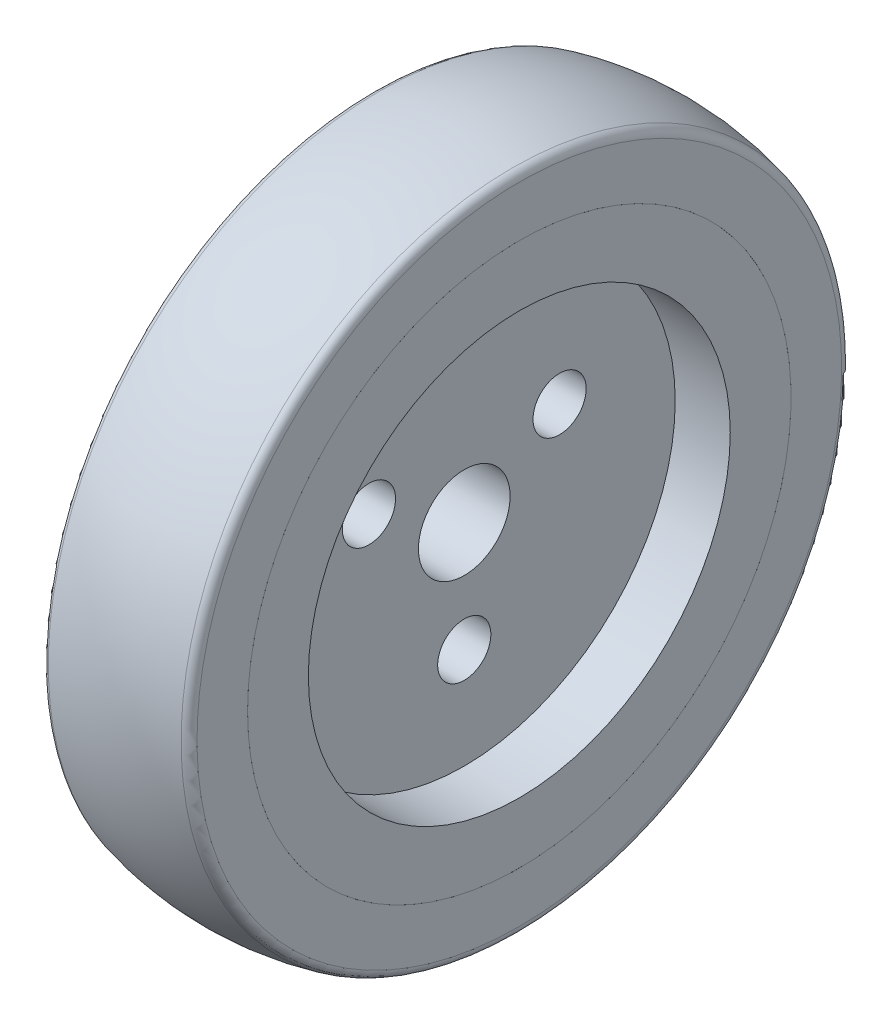
ISO-10303-21;
HEADER;
FILE_DESCRIPTION(('STEP AP214'),'2;1');
FILE_NAME('part.step','',(''),(''),'','','');
FILE_SCHEMA(('AUTOMOTIVE_DESIGN { 1 0 10303 214 1 1 1 1 }'));
ENDSEC;
DATA;
#1=APPLICATION_CONTEXT('core data for automotive mechanical design processes');
#2=APPLICATION_PROTOCOL_DEFINITION('international standard','automotive_design',2000,#1);
#3=PRODUCT_CONTEXT('',#1,'mechanical');
#4=PRODUCT('Part','Part','',(#3));
#5=PRODUCT_RELATED_PRODUCT_CATEGORY('part','',(#4));
#6=PRODUCT_DEFINITION_FORMATION('','',#4);
#7=PRODUCT_DEFINITION_CONTEXT('part definition',#1,'design');
#8=PRODUCT_DEFINITION('design','',#6,#7);
#9=PRODUCT_DEFINITION_SHAPE('','',#8);
#10=(LENGTH_UNIT() NAMED_UNIT(*) SI_UNIT(.MILLI.,.METRE.));
#11=(NAMED_UNIT(*) PLANE_ANGLE_UNIT() SI_UNIT($,.RADIAN.));
#12=(NAMED_UNIT(*) SI_UNIT($,.STERADIAN.) SOLID_ANGLE_UNIT());
#13=UNCERTAINTY_MEASURE_WITH_UNIT(LENGTH_MEASURE(1.E-05),#10,'distance_accuracy_value','');
#14=(GEOMETRIC_REPRESENTATION_CONTEXT(3) GLOBAL_UNCERTAINTY_ASSIGNED_CONTEXT((#13)) GLOBAL_UNIT_ASSIGNED_CONTEXT((#10,
#11,#12)) REPRESENTATION_CONTEXT('',''));
#15=CARTESIAN_POINT('',(0.,0.,0.));
#16=DIRECTION('',(0.,0.,1.));
#17=DIRECTION('',(1.,0.,0.));
#18=AXIS2_PLACEMENT_3D('',#15,#16,#17);
#19=CARTESIAN_POINT('',(4.,17.956832294801,0.));
#20=DIRECTION('',(-1.,0.,0.));
#21=DIRECTION('',(0.,-1.,0.));
#22=AXIS2_PLACEMENT_3D('',#19,#20,#21);
#23=PLANE('',#22);
#24=CARTESIAN_POINT('',(4.,0.,0.));
#25=DIRECTION('',(-1.,0.,0.));
#26=DIRECTION('',(0.,-1.,0.));
#27=AXIS2_PLACEMENT_3D('',#24,#25,#26);
#28=CIRCLE('',#27,17.5712472794703);
#29=CARTESIAN_POINT('',(4.,-17.5712472794703,0.));
#30=VERTEX_POINT('',#29);
#31=EDGE_CURVE('E11',#30,#30,#28,.F.);
#32=ORIENTED_EDGE('',*,*,#31,.T.);
#33=EDGE_LOOP('',(#32));
#34=FACE_BOUND('',#33,.T.);
#35=CARTESIAN_POINT('',(4.00000000000001,0.,0.));
#36=DIRECTION('',(-1.,0.,0.));
#37=DIRECTION('',(0.,0.,1.));
#38=AXIS2_PLACEMENT_3D('',#35,#36,#37);
#39=CIRCLE('',#38,14.8137084989848);
#40=CARTESIAN_POINT('',(4.00000000000001,0.,14.8137084989848));
#41=VERTEX_POINT('',#40);
#42=EDGE_CURVE('E63',#41,#41,#39,.T.);
#43=ORIENTED_EDGE('',*,*,#42,.T.);
#44=EDGE_LOOP('',(#43));
#45=FACE_BOUND('',#44,.T.);
#46=ADVANCED_FACE('F42',(#34,#45),#23,.F.);
#47=CARTESIAN_POINT('',(-4.,2.5,0.));
#48=DIRECTION('',(1.,0.,0.));
#49=DIRECTION('',(0.,1.,0.));
#50=AXIS2_PLACEMENT_3D('',#47,#48,#49);
#51=PLANE('',#50);
#52=CARTESIAN_POINT('',(-4.,0.,0.));
#53=DIRECTION('',(1.,0.,0.));
#54=DIRECTION('',(0.,1.,0.));
#55=AXIS2_PLACEMENT_3D('',#52,#53,#54);
#56=CIRCLE('',#55,17.5712472794703);
#57=CARTESIAN_POINT('',(-4.,17.5712472794703,0.));
#58=VERTEX_POINT('',#57);
#59=EDGE_CURVE('E57',#58,#58,#56,.F.);
#60=ORIENTED_EDGE('',*,*,#59,.T.);
#61=EDGE_LOOP('',(#60));
#62=FACE_BOUND('',#61,.T.);
#63=CARTESIAN_POINT('',(-4.,0.,0.));
#64=DIRECTION('',(-1.,0.,0.));
#65=DIRECTION('',(0.,0.,1.));
#66=AXIS2_PLACEMENT_3D('',#63,#64,#65);
#67=CIRCLE('',#66,14.8137084989848);
#68=CARTESIAN_POINT('',(-4.,0.,14.8137084989848));
#69=VERTEX_POINT('',#68);
#70=EDGE_CURVE('E62',#69,#69,#67,.T.);
#71=ORIENTED_EDGE('',*,*,#70,.F.);
#72=EDGE_LOOP('',(#71));
#73=FACE_BOUND('',#72,.T.);
#74=ADVANCED_FACE('F72',(#62,#73),#51,.F.);
#75=CARTESIAN_POINT('',(0.,0.,0.));
#76=DIRECTION('',(-1.,0.,0.));
#77=DIRECTION('',(0.,-1.,0.));
#78=AXIS2_PLACEMENT_3D('',#75,#76,#77);
#79=DEGENERATE_TOROIDAL_SURFACE('',#78,3.49999999999999,15.,.T.);
#80=CARTESIAN_POINT('',(-3.62068965517242,0.,0.));
#81=DIRECTION('',(1.,0.,0.));
#82=DIRECTION('',(0.,1.,0.));
#83=AXIS2_PLACEMENT_3D('',#80,#81,#82);
#84=CIRCLE('',#83,18.0564627029003);
#85=CARTESIAN_POINT('',(-3.62068965517242,18.0564627029003,0.));
#86=VERTEX_POINT('',#85);
#87=EDGE_CURVE('E49',#86,#86,#84,.T.);
#88=ORIENTED_EDGE('',*,*,#87,.T.);
#89=EDGE_LOOP('',(#88));
#90=FACE_BOUND('',#89,.T.);
#91=CARTESIAN_POINT('',(3.62068965517241,0.,0.));
#92=DIRECTION('',(-1.,0.,0.));
#93=DIRECTION('',(0.,-1.,0.));
#94=AXIS2_PLACEMENT_3D('',#91,#92,#93);
#95=CIRCLE('',#94,18.0564627029003);
#96=CARTESIAN_POINT('',(3.62068965517242,-18.0564627029003,0.));
#97=VERTEX_POINT('',#96);
#98=EDGE_CURVE('E53',#97,#97,#95,.T.);
#99=ORIENTED_EDGE('',*,*,#98,.T.);
#100=EDGE_LOOP('',(#99));
#101=FACE_BOUND('',#100,.T.);
#102=ADVANCED_FACE('F74',(#90,#101),#79,.T.);
#103=CARTESIAN_POINT('',(0.,0.,0.));
#104=DIRECTION('',(-1.,0.,0.));
#105=DIRECTION('',(0.,0.,1.));
#106=AXIS2_PLACEMENT_3D('',#103,#104,#105);
#107=DEGENERATE_TOROIDAL_SURFACE('',#106,3.5,12.,.T.);
#108=ORIENTED_EDGE('',*,*,#70,.T.);
#109=EDGE_LOOP('',(#108));
#110=FACE_BOUND('',#109,.T.);
#111=ORIENTED_EDGE('',*,*,#42,.F.);
#112=EDGE_LOOP('',(#111));
#113=FACE_BOUND('',#112,.T.);
#114=ADVANCED_FACE('F69',(#110,#113),#107,.F.);
#115=CARTESIAN_POINT('',(-3.5,0.,0.));
#116=DIRECTION('',(1.,0.,0.));
#117=DIRECTION('',(0.,1.,0.));
#118=AXIS2_PLACEMENT_3D('',#115,#116,#117);
#119=TOROIDAL_SURFACE('',#118,17.5712472794703,0.5);
#120=ORIENTED_EDGE('',*,*,#87,.F.);
#121=EDGE_LOOP('',(#120));
#122=FACE_BOUND('',#121,.T.);
#123=ORIENTED_EDGE('',*,*,#59,.F.);
#124=EDGE_LOOP('',(#123));
#125=FACE_BOUND('',#124,.T.);
#126=ADVANCED_FACE('F84',(#122,#125),#119,.T.);
#127=CARTESIAN_POINT('',(3.5,0.,0.));
#128=DIRECTION('',(-1.,0.,0.));
#129=DIRECTION('',(0.,-1.,0.));
#130=AXIS2_PLACEMENT_3D('',#127,#128,#129);
#131=TOROIDAL_SURFACE('',#130,17.5712472794703,0.5);
#132=ORIENTED_EDGE('',*,*,#31,.F.);
#133=EDGE_LOOP('',(#132));
#134=FACE_BOUND('',#133,.T.);
#135=ORIENTED_EDGE('',*,*,#98,.F.);
#136=EDGE_LOOP('',(#135));
#137=FACE_BOUND('',#136,.T.);
#138=ADVANCED_FACE('F44',(#134,#137),#131,.T.);
#139=CLOSED_SHELL('',(#46,#74,#102,#114,#126,#138));
#140=MANIFOLD_SOLID_BREP('B2',#139);
#141=CARTESIAN_POINT('',(4.,17.956832294801,0.));
#142=DIRECTION('',(-1.,0.,0.));
#143=DIRECTION('',(0.,-1.,0.));
#144=AXIS2_PLACEMENT_3D('',#141,#142,#143);
#145=PLANE('',#144);
#146=CARTESIAN_POINT('',(4.00000000000001,0.,0.));
#147=DIRECTION('',(-1.,0.,0.));
#148=DIRECTION('',(0.,0.,1.));
#149=AXIS2_PLACEMENT_3D('',#146,#147,#148);
#150=CIRCLE('',#149,14.8126478332882);
#151=CARTESIAN_POINT('',(4.00000000000001,0.,14.8126478332882));
#152=VERTEX_POINT('',#151);
#153=EDGE_CURVE('E150',#152,#152,#150,.T.);
#154=ORIENTED_EDGE('',*,*,#153,.F.);
#155=EDGE_LOOP('',(#154));
#156=FACE_BOUND('',#155,.T.);
#157=CARTESIAN_POINT('',(4.00000000000002,0.,0.));
#158=DIRECTION('',(-1.,0.,0.));
#159=DIRECTION('',(0.,-1.,0.));
#160=AXIS2_PLACEMENT_3D('',#157,#158,#159);
#161=CIRCLE('',#160,11.5);
#162=CARTESIAN_POINT('',(4.00000000000003,-11.5,0.));
#163=VERTEX_POINT('',#162);
#164=EDGE_CURVE('E165',#163,#163,#161,.T.);
#165=ORIENTED_EDGE('',*,*,#164,.T.);
#166=EDGE_LOOP('',(#165));
#167=FACE_BOUND('',#166,.T.);
#168=ADVANCED_FACE('F143',(#156,#167),#145,.F.);
#169=CARTESIAN_POINT('',(-12.5,0.,0.));
#170=DIRECTION('',(-1.,0.,0.));
#171=DIRECTION('',(0.,-1.,0.));
#172=AXIS2_PLACEMENT_3D('',#169,#170,#171);
#173=CYLINDRICAL_SURFACE('',#172,2.5);
#174=CARTESIAN_POINT('',(-4.5,0.,0.));
#175=DIRECTION('',(1.,0.,0.));
#176=DIRECTION('',(0.,1.,0.));
#177=AXIS2_PLACEMENT_3D('',#174,#175,#176);
#178=CIRCLE('',#177,2.5);
#179=CARTESIAN_POINT('',(-4.5,2.5,0.));
#180=VERTEX_POINT('',#179);
#181=EDGE_CURVE('E154',#180,#180,#178,.T.);
#182=ORIENTED_EDGE('',*,*,#181,.F.);
#183=EDGE_LOOP('',(#182));
#184=FACE_BOUND('',#183,.T.);
#185=CARTESIAN_POINT('',(1.00000000000001,0.,0.));
#186=DIRECTION('',(1.,0.,0.));
#187=DIRECTION('',(0.,1.,0.));
#188=AXIS2_PLACEMENT_3D('',#185,#186,#187);
#189=CIRCLE('',#188,2.5);
#190=CARTESIAN_POINT('',(1.00000000000001,2.5,0.));
#191=VERTEX_POINT('',#190);
#192=EDGE_CURVE('E146',#191,#191,#189,.F.);
#193=ORIENTED_EDGE('',*,*,#192,.F.);
#194=EDGE_LOOP('',(#193));
#195=FACE_BOUND('',#194,.T.);
#196=ADVANCED_FACE('F207',(#184,#195),#173,.F.);
#197=CARTESIAN_POINT('',(-4.,2.5,0.));
#198=DIRECTION('',(1.,0.,0.));
#199=DIRECTION('',(0.,1.,0.));
#200=AXIS2_PLACEMENT_3D('',#197,#198,#199);
#201=PLANE('',#200);
#202=CARTESIAN_POINT('',(-4.,0.,0.));
#203=DIRECTION('',(1.,0.,0.));
#204=DIRECTION('',(0.,1.,0.));
#205=AXIS2_PLACEMENT_3D('',#202,#203,#204);
#206=CIRCLE('',#205,11.5);
#207=CARTESIAN_POINT('',(-4.,11.5,0.));
#208=VERTEX_POINT('',#207);
#209=EDGE_CURVE('E162',#208,#208,#206,.T.);
#210=ORIENTED_EDGE('',*,*,#209,.T.);
#211=EDGE_LOOP('',(#210));
#212=FACE_BOUND('',#211,.T.);
#213=CARTESIAN_POINT('',(-4.,0.,0.));
#214=DIRECTION('',(-1.,0.,0.));
#215=DIRECTION('',(0.,0.,1.));
#216=AXIS2_PLACEMENT_3D('',#213,#214,#215);
#217=CIRCLE('',#216,14.8126478332882);
#218=CARTESIAN_POINT('',(-4.,0.,14.8126478332882));
#219=VERTEX_POINT('',#218);
#220=EDGE_CURVE('E41',#219,#219,#217,.T.);
#221=ORIENTED_EDGE('',*,*,#220,.T.);
#222=EDGE_LOOP('',(#221));
#223=FACE_BOUND('',#222,.T.);
#224=ADVANCED_FACE('F209',(#212,#223),#201,.F.);
#225=CARTESIAN_POINT('',(0.,0.,0.));
#226=DIRECTION('',(-1.,0.,0.));
#227=DIRECTION('',(0.,0.,1.));
#228=AXIS2_PLACEMENT_3D('',#225,#226,#227);
#229=DEGENERATE_TOROIDAL_SURFACE('',#228,3.5,11.999,.T.);
#230=ORIENTED_EDGE('',*,*,#153,.T.);
#231=EDGE_LOOP('',(#230));
#232=FACE_BOUND('',#231,.T.);
#233=ORIENTED_EDGE('',*,*,#220,.F.);
#234=EDGE_LOOP('',(#233));
#235=FACE_BOUND('',#234,.T.);
#236=ADVANCED_FACE('F215',(#232,#235),#229,.T.);
#237=CARTESIAN_POINT('',(-4.5,2.5,0.));
#238=DIRECTION('',(-1.,0.,0.));
#239=DIRECTION('',(0.,-1.,0.));
#240=AXIS2_PLACEMENT_3D('',#237,#238,#239);
#241=PLANE('',#240);
#242=CARTESIAN_POINT('',(-4.50000000000001,2.99999999999995,-5.19615242270666));
#243=DIRECTION('',(1.,0.,0.));
#244=DIRECTION('',(0.,0.,-1.));
#245=AXIS2_PLACEMENT_3D('',#242,#243,#244);
#246=CIRCLE('',#245,1.45);
#247=CARTESIAN_POINT('',(-4.50000000000001,2.99999999999995,-6.64615242270666));
#248=VERTEX_POINT('',#247);
#249=EDGE_CURVE('E183',#248,#248,#246,.T.);
#250=ORIENTED_EDGE('',*,*,#249,.T.);
#251=EDGE_LOOP('',(#250));
#252=FACE_BOUND('',#251,.T.);
#253=CARTESIAN_POINT('',(-4.50000000000001,3.00000000000002,5.19615242270662));
#254=DIRECTION('',(1.,0.,0.));
#255=DIRECTION('',(0.,0.,-1.));
#256=AXIS2_PLACEMENT_3D('',#253,#254,#255);
#257=CIRCLE('',#256,1.45);
#258=CARTESIAN_POINT('',(-4.50000000000001,3.00000000000002,3.74615242270662));
#259=VERTEX_POINT('',#258);
#260=EDGE_CURVE('E177',#259,#259,#257,.T.);
#261=ORIENTED_EDGE('',*,*,#260,.T.);
#262=EDGE_LOOP('',(#261));
#263=FACE_BOUND('',#262,.T.);
#264=CARTESIAN_POINT('',(-4.50000000000001,-6.,0.));
#265=DIRECTION('',(1.,0.,0.));
#266=DIRECTION('',(0.,0.,-1.));
#267=AXIS2_PLACEMENT_3D('',#264,#265,#266);
#268=CIRCLE('',#267,1.45);
#269=CARTESIAN_POINT('',(-4.50000000000001,-6.,-1.45));
#270=VERTEX_POINT('',#269);
#271=EDGE_CURVE('E171',#270,#270,#268,.T.);
#272=ORIENTED_EDGE('',*,*,#271,.T.);
#273=EDGE_LOOP('',(#272));
#274=FACE_BOUND('',#273,.T.);
#275=ORIENTED_EDGE('',*,*,#181,.T.);
#276=EDGE_LOOP('',(#275));
#277=FACE_BOUND('',#276,.T.);
#278=CARTESIAN_POINT('',(-4.5,0.,0.));
#279=DIRECTION('',(1.,0.,0.));
#280=DIRECTION('',(0.,1.,0.));
#281=AXIS2_PLACEMENT_3D('',#278,#279,#280);
#282=CIRCLE('',#281,11.5);
#283=CARTESIAN_POINT('',(-4.5,11.5,0.));
#284=VERTEX_POINT('',#283);
#285=EDGE_CURVE('E159',#284,#284,#282,.T.);
#286=ORIENTED_EDGE('',*,*,#285,.F.);
#287=EDGE_LOOP('',(#286));
#288=FACE_BOUND('',#287,.T.);
#289=ADVANCED_FACE('F223',(#252,#263,#274,#277,#288),#241,.T.);
#290=CARTESIAN_POINT('',(4.,0.,0.));
#291=DIRECTION('',(1.,0.,0.));
#292=DIRECTION('',(0.,1.,0.));
#293=AXIS2_PLACEMENT_3D('',#290,#291,#292);
#294=CYLINDRICAL_SURFACE('',#293,11.5);
#295=ORIENTED_EDGE('',*,*,#285,.T.);
#296=EDGE_LOOP('',(#295));
#297=FACE_BOUND('',#296,.T.);
#298=ORIENTED_EDGE('',*,*,#209,.F.);
#299=EDGE_LOOP('',(#298));
#300=FACE_BOUND('',#299,.T.);
#301=ADVANCED_FACE('F196',(#297,#300),#294,.T.);
#302=CARTESIAN_POINT('',(0.999999999999996,11.5,0.));
#303=DIRECTION('',(1.,0.,0.));
#304=DIRECTION('',(0.,1.,0.));
#305=AXIS2_PLACEMENT_3D('',#302,#303,#304);
#306=PLANE('',#305);
#307=CARTESIAN_POINT('',(1.00000000000001,2.99999999999995,-5.19615242270666));
#308=DIRECTION('',(1.,0.,0.));
#309=DIRECTION('',(0.,0.,-1.));
#310=AXIS2_PLACEMENT_3D('',#307,#308,#309);
#311=CIRCLE('',#310,1.45);
#312=CARTESIAN_POINT('',(1.00000000000002,2.99999999999995,-6.64615242270666));
#313=VERTEX_POINT('',#312);
#314=EDGE_CURVE('E186',#313,#313,#311,.T.);
#315=ORIENTED_EDGE('',*,*,#314,.F.);
#316=EDGE_LOOP('',(#315));
#317=FACE_BOUND('',#316,.T.);
#318=CARTESIAN_POINT('',(1.00000000000001,3.00000000000002,5.19615242270662));
#319=DIRECTION('',(1.,0.,0.));
#320=DIRECTION('',(0.,0.,-1.));
#321=AXIS2_PLACEMENT_3D('',#318,#319,#320);
#322=CIRCLE('',#321,1.45);
#323=CARTESIAN_POINT('',(1.00000000000001,3.00000000000002,3.74615242270662));
#324=VERTEX_POINT('',#323);
#325=EDGE_CURVE('E180',#324,#324,#322,.T.);
#326=ORIENTED_EDGE('',*,*,#325,.F.);
#327=EDGE_LOOP('',(#326));
#328=FACE_BOUND('',#327,.T.);
#329=CARTESIAN_POINT('',(1.00000000000002,-6.,0.));
#330=DIRECTION('',(1.,0.,0.));
#331=DIRECTION('',(0.,0.,-1.));
#332=AXIS2_PLACEMENT_3D('',#329,#330,#331);
#333=CIRCLE('',#332,1.45);
#334=CARTESIAN_POINT('',(1.00000000000002,-6.,-1.45));
#335=VERTEX_POINT('',#334);
#336=EDGE_CURVE('E174',#335,#335,#333,.T.);
#337=ORIENTED_EDGE('',*,*,#336,.F.);
#338=EDGE_LOOP('',(#337));
#339=FACE_BOUND('',#338,.T.);
#340=CARTESIAN_POINT('',(1.00000000000001,0.,0.));
#341=DIRECTION('',(-1.,0.,0.));
#342=DIRECTION('',(0.,-1.,0.));
#343=AXIS2_PLACEMENT_3D('',#340,#341,#342);
#344=CIRCLE('',#343,11.5);
#345=CARTESIAN_POINT('',(1.00000000000003,-11.5,0.));
#346=VERTEX_POINT('',#345);
#347=EDGE_CURVE('E168',#346,#346,#344,.T.);
#348=ORIENTED_EDGE('',*,*,#347,.F.);
#349=EDGE_LOOP('',(#348));
#350=FACE_BOUND('',#349,.T.);
#351=ORIENTED_EDGE('',*,*,#192,.T.);
#352=EDGE_LOOP('',(#351));
#353=FACE_BOUND('',#352,.T.);
#354=ADVANCED_FACE('F192',(#317,#328,#339,#350,#353),#306,.T.);
#355=CARTESIAN_POINT('',(1.,0.,0.));
#356=DIRECTION('',(-1.,0.,0.));
#357=DIRECTION('',(0.,-1.,0.));
#358=AXIS2_PLACEMENT_3D('',#355,#356,#357);
#359=CYLINDRICAL_SURFACE('',#358,11.5);
#360=ORIENTED_EDGE('',*,*,#347,.T.);
#361=EDGE_LOOP('',(#360));
#362=FACE_BOUND('',#361,.T.);
#363=ORIENTED_EDGE('',*,*,#164,.F.);
#364=EDGE_LOOP('',(#363));
#365=FACE_BOUND('',#364,.T.);
#366=ADVANCED_FACE('F195',(#362,#365),#359,.F.);
#367=CARTESIAN_POINT('',(1.00000000000002,-6.,0.));
#368=DIRECTION('',(1.,0.,0.));
#369=DIRECTION('',(0.,0.,-1.));
#370=AXIS2_PLACEMENT_3D('',#367,#368,#369);
#371=CYLINDRICAL_SURFACE('',#370,1.45);
#372=ORIENTED_EDGE('',*,*,#271,.F.);
#373=EDGE_LOOP('',(#372));
#374=FACE_BOUND('',#373,.T.);
#375=ORIENTED_EDGE('',*,*,#336,.T.);
#376=EDGE_LOOP('',(#375));
#377=FACE_BOUND('',#376,.T.);
#378=ADVANCED_FACE('F232',(#374,#377),#371,.F.);
#379=CARTESIAN_POINT('',(1.00000000000001,3.00000000000002,5.19615242270662));
#380=DIRECTION('',(1.,0.,0.));
#381=DIRECTION('',(0.,0.,-1.));
#382=AXIS2_PLACEMENT_3D('',#379,#380,#381);
#383=CYLINDRICAL_SURFACE('',#382,1.45);
#384=ORIENTED_EDGE('',*,*,#260,.F.);
#385=EDGE_LOOP('',(#384));
#386=FACE_BOUND('',#385,.T.);
#387=ORIENTED_EDGE('',*,*,#325,.T.);
#388=EDGE_LOOP('',(#387));
#389=FACE_BOUND('',#388,.T.);
#390=ADVANCED_FACE('F237',(#386,#389),#383,.F.);
#391=CARTESIAN_POINT('',(1.00000000000001,2.99999999999995,-5.19615242270666));
#392=DIRECTION('',(1.,0.,0.));
#393=DIRECTION('',(0.,0.,-1.));
#394=AXIS2_PLACEMENT_3D('',#391,#392,#393);
#395=CYLINDRICAL_SURFACE('',#394,1.45);
#396=ORIENTED_EDGE('',*,*,#249,.F.);
#397=EDGE_LOOP('',(#396));
#398=FACE_BOUND('',#397,.T.);
#399=ORIENTED_EDGE('',*,*,#314,.T.);
#400=EDGE_LOOP('',(#399));
#401=FACE_BOUND('',#400,.T.);
#402=ADVANCED_FACE('F190',(#398,#401),#395,.F.);
#403=CLOSED_SHELL('',(#168,#196,#224,#236,#289,#301,#354,#366,#378,#390,#402));
#404=MANIFOLD_SOLID_BREP('B6',#403);
#405=ADVANCED_BREP_SHAPE_REPRESENTATION('',(#18,#140,#404),#14);
#406=SHAPE_DEFINITION_REPRESENTATION(#9,#405);
ENDSEC;
END-ISO-10303-21;
